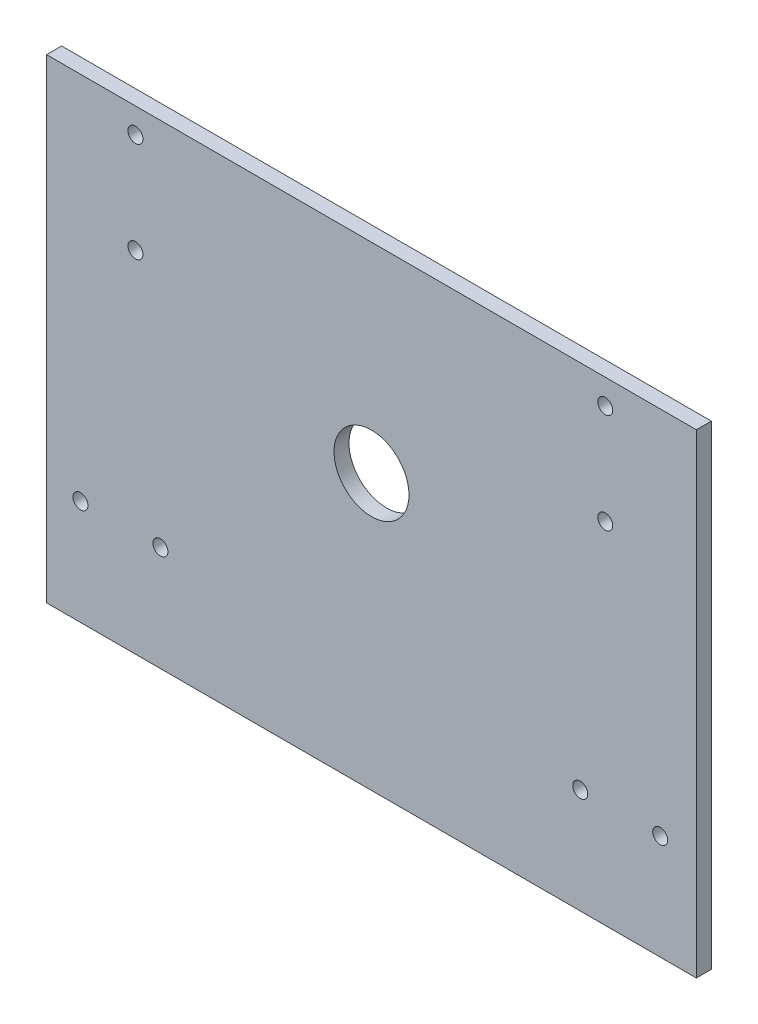
ISO-10303-21;
HEADER;
FILE_DESCRIPTION(('STEP AP214'),'2;1');
FILE_NAME('part.step','',(''),(''),'','','');
FILE_SCHEMA(('AUTOMOTIVE_DESIGN { 1 0 10303 214 1 1 1 1 }'));
ENDSEC;
DATA;
#1=APPLICATION_CONTEXT('core data for automotive mechanical design processes');
#2=APPLICATION_PROTOCOL_DEFINITION('international standard','automotive_design',2000,#1);
#3=PRODUCT_CONTEXT('',#1,'mechanical');
#4=PRODUCT('Part','Part','',(#3));
#5=PRODUCT_RELATED_PRODUCT_CATEGORY('part','',(#4));
#6=PRODUCT_DEFINITION_FORMATION('','',#4);
#7=PRODUCT_DEFINITION_CONTEXT('part definition',#1,'design');
#8=PRODUCT_DEFINITION('design','',#6,#7);
#9=PRODUCT_DEFINITION_SHAPE('','',#8);
#10=(LENGTH_UNIT() NAMED_UNIT(*) SI_UNIT(.MILLI.,.METRE.));
#11=(NAMED_UNIT(*) PLANE_ANGLE_UNIT() SI_UNIT($,.RADIAN.));
#12=(NAMED_UNIT(*) SI_UNIT($,.STERADIAN.) SOLID_ANGLE_UNIT());
#13=UNCERTAINTY_MEASURE_WITH_UNIT(LENGTH_MEASURE(1.E-05),#10,'distance_accuracy_value','');
#14=(GEOMETRIC_REPRESENTATION_CONTEXT(3) GLOBAL_UNCERTAINTY_ASSIGNED_CONTEXT((#13)) GLOBAL_UNIT_ASSIGNED_CONTEXT((#10,
#11,#12)) REPRESENTATION_CONTEXT('',''));
#15=CARTESIAN_POINT('',(0.,0.,0.));
#16=DIRECTION('',(0.,0.,1.));
#17=DIRECTION('',(1.,0.,0.));
#18=AXIS2_PLACEMENT_3D('',#15,#16,#17);
#19=CARTESIAN_POINT('',(-65.,-47.5,3.));
#20=DIRECTION('',(1.,0.,0.));
#21=DIRECTION('',(0.,0.,-1.));
#22=AXIS2_PLACEMENT_3D('',#19,#20,#21);
#23=PLANE('',#22);
#24=DIRECTION('',(0.,-1.,0.));
#25=VECTOR('',#24,1.);
#26=CARTESIAN_POINT('',(-65.,-47.5,0.));
#27=LINE('',#26,#25);
#28=CARTESIAN_POINT('',(-65.,47.5,0.));
#29=VERTEX_POINT('',#28);
#30=CARTESIAN_POINT('',(-65.,-47.5,0.));
#31=VERTEX_POINT('',#30);
#32=EDGE_CURVE('E105',#29,#31,#27,.T.);
#33=ORIENTED_EDGE('',*,*,#32,.T.);
#34=DIRECTION('',(0.,0.,-1.));
#35=VECTOR('',#34,1.);
#36=CARTESIAN_POINT('',(-65.,-47.5,3.));
#37=LINE('',#36,#35);
#38=CARTESIAN_POINT('',(-65.,-47.5,3.));
#39=VERTEX_POINT('',#38);
#40=EDGE_CURVE('E11',#39,#31,#37,.T.);
#41=ORIENTED_EDGE('',*,*,#40,.F.);
#42=DIRECTION('',(0.,-1.,0.));
#43=VECTOR('',#42,1.);
#44=CARTESIAN_POINT('',(-65.,-47.5,3.));
#45=LINE('',#44,#43);
#46=CARTESIAN_POINT('',(-65.,47.5,3.));
#47=VERTEX_POINT('',#46);
#48=EDGE_CURVE('E92',#47,#39,#45,.T.);
#49=ORIENTED_EDGE('',*,*,#48,.F.);
#50=DIRECTION('',(0.,0.,-1.));
#51=VECTOR('',#50,1.);
#52=CARTESIAN_POINT('',(-65.,47.5,3.));
#53=LINE('',#52,#51);
#54=EDGE_CURVE('E101',#47,#29,#53,.T.);
#55=ORIENTED_EDGE('',*,*,#54,.T.);
#56=EDGE_LOOP('',(#33,#41,#49,#55));
#57=FACE_BOUND('',#56,.T.);
#58=ADVANCED_FACE('F40',(#57),#23,.F.);
#59=CARTESIAN_POINT('',(65.,-47.5,3.));
#60=DIRECTION('',(0.,1.,0.));
#61=DIRECTION('',(-1.,0.,0.));
#62=AXIS2_PLACEMENT_3D('',#59,#60,#61);
#63=PLANE('',#62);
#64=DIRECTION('',(1.,0.,0.));
#65=VECTOR('',#64,1.);
#66=CARTESIAN_POINT('',(65.,-47.5,0.));
#67=LINE('',#66,#65);
#68=CARTESIAN_POINT('',(65.,-47.5,0.));
#69=VERTEX_POINT('',#68);
#70=EDGE_CURVE('E96',#31,#69,#67,.T.);
#71=ORIENTED_EDGE('',*,*,#70,.T.);
#72=DIRECTION('',(0.,0.,-1.));
#73=VECTOR('',#72,1.);
#74=CARTESIAN_POINT('',(65.,-47.5,3.));
#75=LINE('',#74,#73);
#76=CARTESIAN_POINT('',(65.,-47.5,3.));
#77=VERTEX_POINT('',#76);
#78=EDGE_CURVE('E49',#77,#69,#75,.T.);
#79=ORIENTED_EDGE('',*,*,#78,.F.);
#80=DIRECTION('',(1.,0.,0.));
#81=VECTOR('',#80,1.);
#82=CARTESIAN_POINT('',(65.,-47.5,3.));
#83=LINE('',#82,#81);
#84=EDGE_CURVE('E87',#39,#77,#83,.T.);
#85=ORIENTED_EDGE('',*,*,#84,.F.);
#86=ORIENTED_EDGE('',*,*,#40,.T.);
#87=EDGE_LOOP('',(#71,#79,#85,#86));
#88=FACE_BOUND('',#87,.T.);
#89=ADVANCED_FACE('F95',(#88),#63,.F.);
#90=CARTESIAN_POINT('',(65.,-47.5,3.));
#91=DIRECTION('',(-1.,0.,0.));
#92=DIRECTION('',(0.,0.,1.));
#93=AXIS2_PLACEMENT_3D('',#90,#91,#92);
#94=PLANE('',#93);
#95=DIRECTION('',(0.,1.,0.));
#96=VECTOR('',#95,1.);
#97=CARTESIAN_POINT('',(65.,-47.5,0.));
#98=LINE('',#97,#96);
#99=CARTESIAN_POINT('',(65.,47.5,0.));
#100=VERTEX_POINT('',#99);
#101=EDGE_CURVE('E74',#69,#100,#98,.T.);
#102=ORIENTED_EDGE('',*,*,#101,.T.);
#103=DIRECTION('',(0.,0.,-1.));
#104=VECTOR('',#103,1.);
#105=CARTESIAN_POINT('',(65.,47.5,3.));
#106=LINE('',#105,#104);
#107=CARTESIAN_POINT('',(65.,47.5,3.));
#108=VERTEX_POINT('',#107);
#109=EDGE_CURVE('E97',#108,#100,#106,.T.);
#110=ORIENTED_EDGE('',*,*,#109,.F.);
#111=DIRECTION('',(0.,1.,0.));
#112=VECTOR('',#111,1.);
#113=CARTESIAN_POINT('',(65.,-47.5,3.));
#114=LINE('',#113,#112);
#115=EDGE_CURVE('E90',#77,#108,#114,.T.);
#116=ORIENTED_EDGE('',*,*,#115,.F.);
#117=ORIENTED_EDGE('',*,*,#78,.T.);
#118=EDGE_LOOP('',(#102,#110,#116,#117));
#119=FACE_BOUND('',#118,.T.);
#120=ADVANCED_FACE('F99',(#119),#94,.F.);
#121=CARTESIAN_POINT('',(65.,47.5,3.));
#122=DIRECTION('',(0.,-1.,0.));
#123=DIRECTION('',(1.,0.,0.));
#124=AXIS2_PLACEMENT_3D('',#121,#122,#123);
#125=PLANE('',#124);
#126=DIRECTION('',(-1.,0.,0.));
#127=VECTOR('',#126,1.);
#128=CARTESIAN_POINT('',(65.,47.5,0.));
#129=LINE('',#128,#127);
#130=EDGE_CURVE('E80',#100,#29,#129,.T.);
#131=ORIENTED_EDGE('',*,*,#130,.T.);
#132=ORIENTED_EDGE('',*,*,#54,.F.);
#133=DIRECTION('',(-1.,0.,0.));
#134=VECTOR('',#133,1.);
#135=CARTESIAN_POINT('',(65.,47.5,3.));
#136=LINE('',#135,#134);
#137=EDGE_CURVE('E57',#108,#47,#136,.T.);
#138=ORIENTED_EDGE('',*,*,#137,.F.);
#139=ORIENTED_EDGE('',*,*,#109,.T.);
#140=EDGE_LOOP('',(#131,#132,#138,#139));
#141=FACE_BOUND('',#140,.T.);
#142=ADVANCED_FACE('F113',(#141),#125,.F.);
#143=CARTESIAN_POINT('',(0.,0.,3.));
#144=DIRECTION('',(0.,0.,1.));
#145=DIRECTION('',(1.,0.,0.));
#146=AXIS2_PLACEMENT_3D('',#143,#144,#145);
#147=PLANE('',#146);
#148=CARTESIAN_POINT('',(1.81105130891979E-12,7.45258790206308,3.));
#149=DIRECTION('',(0.,0.,1.));
#150=DIRECTION('',(1.,0.,0.));
#151=AXIS2_PLACEMENT_3D('',#148,#149,#150);
#152=CIRCLE('',#151,7.5);
#153=CARTESIAN_POINT('',(7.50000000000181,7.45258790206308,3.));
#154=VERTEX_POINT('',#153);
#155=EDGE_CURVE('E166',#154,#154,#152,.T.);
#156=ORIENTED_EDGE('',*,*,#155,.F.);
#157=EDGE_LOOP('',(#156));
#158=FACE_BOUND('',#157,.T.);
#159=CARTESIAN_POINT('',(46.7671126155352,22.5,3.));
#160=DIRECTION('',(0.,0.,1.));
#161=DIRECTION('',(1.,0.,0.));
#162=AXIS2_PLACEMENT_3D('',#159,#160,#161);
#163=CIRCLE('',#162,1.5);
#164=CARTESIAN_POINT('',(48.2671126155352,22.5,3.));
#165=VERTEX_POINT('',#164);
#166=EDGE_CURVE('E135',#165,#165,#163,.T.);
#167=ORIENTED_EDGE('',*,*,#166,.F.);
#168=EDGE_LOOP('',(#167));
#169=FACE_BOUND('',#168,.T.);
#170=CARTESIAN_POINT('',(-47.2328873844649,42.5,3.));
#171=DIRECTION('',(0.,0.,1.));
#172=DIRECTION('',(1.,0.,0.));
#173=AXIS2_PLACEMENT_3D('',#170,#171,#172);
#174=CIRCLE('',#173,1.5);
#175=CARTESIAN_POINT('',(-45.7328873844649,42.5,3.));
#176=VERTEX_POINT('',#175);
#177=EDGE_CURVE('E145',#176,#176,#174,.T.);
#178=ORIENTED_EDGE('',*,*,#177,.F.);
#179=EDGE_LOOP('',(#178));
#180=FACE_BOUND('',#179,.T.);
#181=CARTESIAN_POINT('',(-47.2328873844649,22.5,3.));
#182=DIRECTION('',(0.,0.,1.));
#183=DIRECTION('',(1.,0.,0.));
#184=AXIS2_PLACEMENT_3D('',#181,#182,#183);
#185=CIRCLE('',#184,1.5);
#186=CARTESIAN_POINT('',(-45.7328873844649,22.5,3.));
#187=VERTEX_POINT('',#186);
#188=EDGE_CURVE('E148',#187,#187,#185,.T.);
#189=ORIENTED_EDGE('',*,*,#188,.F.);
#190=EDGE_LOOP('',(#189));
#191=FACE_BOUND('',#190,.T.);
#192=CARTESIAN_POINT('',(46.7671126155352,42.5,3.));
#193=DIRECTION('',(0.,0.,1.));
#194=DIRECTION('',(1.,0.,0.));
#195=AXIS2_PLACEMENT_3D('',#192,#193,#194);
#196=CIRCLE('',#195,1.5);
#197=CARTESIAN_POINT('',(48.2671126155352,42.5,3.));
#198=VERTEX_POINT('',#197);
#199=EDGE_CURVE('E151',#198,#198,#196,.T.);
#200=ORIENTED_EDGE('',*,*,#199,.F.);
#201=EDGE_LOOP('',(#200));
#202=FACE_BOUND('',#201,.T.);
#203=CARTESIAN_POINT('',(57.7671126155351,-26.5,3.));
#204=DIRECTION('',(0.,0.,1.));
#205=DIRECTION('',(1.,0.,0.));
#206=AXIS2_PLACEMENT_3D('',#203,#204,#205);
#207=CIRCLE('',#206,1.5);
#208=CARTESIAN_POINT('',(59.2671126155351,-26.5,3.));
#209=VERTEX_POINT('',#208);
#210=EDGE_CURVE('E108',#209,#209,#207,.T.);
#211=ORIENTED_EDGE('',*,*,#210,.F.);
#212=EDGE_LOOP('',(#211));
#213=FACE_BOUND('',#212,.T.);
#214=CARTESIAN_POINT('',(41.7671126155351,-26.5,3.));
#215=DIRECTION('',(0.,0.,1.));
#216=DIRECTION('',(1.,0.,0.));
#217=AXIS2_PLACEMENT_3D('',#214,#215,#216);
#218=CIRCLE('',#217,1.5);
#219=CARTESIAN_POINT('',(43.2671126155351,-26.5,3.));
#220=VERTEX_POINT('',#219);
#221=EDGE_CURVE('E121',#220,#220,#218,.T.);
#222=ORIENTED_EDGE('',*,*,#221,.F.);
#223=EDGE_LOOP('',(#222));
#224=FACE_BOUND('',#223,.T.);
#225=CARTESIAN_POINT('',(-42.2328873844649,-26.5,3.));
#226=DIRECTION('',(0.,0.,1.));
#227=DIRECTION('',(1.,0.,0.));
#228=AXIS2_PLACEMENT_3D('',#225,#226,#227);
#229=CIRCLE('',#228,1.5);
#230=CARTESIAN_POINT('',(-40.7328873844649,-26.5,3.));
#231=VERTEX_POINT('',#230);
#232=EDGE_CURVE('E124',#231,#231,#229,.T.);
#233=ORIENTED_EDGE('',*,*,#232,.F.);
#234=EDGE_LOOP('',(#233));
#235=FACE_BOUND('',#234,.T.);
#236=CARTESIAN_POINT('',(-58.2328873844649,-26.5,3.));
#237=DIRECTION('',(0.,0.,1.));
#238=DIRECTION('',(1.,0.,0.));
#239=AXIS2_PLACEMENT_3D('',#236,#237,#238);
#240=CIRCLE('',#239,1.5);
#241=CARTESIAN_POINT('',(-56.7328873844649,-26.5,3.));
#242=VERTEX_POINT('',#241);
#243=EDGE_CURVE('E127',#242,#242,#240,.T.);
#244=ORIENTED_EDGE('',*,*,#243,.F.);
#245=EDGE_LOOP('',(#244));
#246=FACE_BOUND('',#245,.T.);
#247=ORIENTED_EDGE('',*,*,#48,.T.);
#248=ORIENTED_EDGE('',*,*,#84,.T.);
#249=ORIENTED_EDGE('',*,*,#115,.T.);
#250=ORIENTED_EDGE('',*,*,#137,.T.);
#251=EDGE_LOOP('',(#247,#248,#249,#250));
#252=FACE_BOUND('',#251,.T.);
#253=ADVANCED_FACE('F88',(#158,#169,#180,#191,#202,#213,#224,#235,#246,#252),#147,.T.);
#254=CARTESIAN_POINT('',(0.,0.,0.));
#255=DIRECTION('',(0.,0.,1.));
#256=DIRECTION('',(1.,0.,0.));
#257=AXIS2_PLACEMENT_3D('',#254,#255,#256);
#258=PLANE('',#257);
#259=CARTESIAN_POINT('',(1.81105130891979E-12,7.45258790206308,0.));
#260=DIRECTION('',(0.,0.,1.));
#261=DIRECTION('',(1.,0.,0.));
#262=AXIS2_PLACEMENT_3D('',#259,#260,#261);
#263=CIRCLE('',#262,7.5);
#264=CARTESIAN_POINT('',(7.50000000000181,7.45258790206308,0.));
#265=VERTEX_POINT('',#264);
#266=EDGE_CURVE('E43',#265,#265,#263,.T.);
#267=ORIENTED_EDGE('',*,*,#266,.T.);
#268=EDGE_LOOP('',(#267));
#269=FACE_BOUND('',#268,.T.);
#270=CARTESIAN_POINT('',(46.7671126155352,22.5,0.));
#271=DIRECTION('',(0.,0.,-1.));
#272=DIRECTION('',(-1.,0.,0.));
#273=AXIS2_PLACEMENT_3D('',#270,#271,#272);
#274=CIRCLE('',#273,1.5);
#275=CARTESIAN_POINT('',(45.2671126155352,22.5,0.));
#276=VERTEX_POINT('',#275);
#277=EDGE_CURVE('E157',#276,#276,#274,.T.);
#278=ORIENTED_EDGE('',*,*,#277,.F.);
#279=EDGE_LOOP('',(#278));
#280=FACE_BOUND('',#279,.T.);
#281=CARTESIAN_POINT('',(-47.2328873844649,42.5,0.));
#282=DIRECTION('',(0.,0.,-1.));
#283=DIRECTION('',(-1.,0.,0.));
#284=AXIS2_PLACEMENT_3D('',#281,#282,#283);
#285=CIRCLE('',#284,1.5);
#286=CARTESIAN_POINT('',(-48.7328873844649,42.5,0.));
#287=VERTEX_POINT('',#286);
#288=EDGE_CURVE('E158',#287,#287,#285,.T.);
#289=ORIENTED_EDGE('',*,*,#288,.F.);
#290=EDGE_LOOP('',(#289));
#291=FACE_BOUND('',#290,.T.);
#292=CARTESIAN_POINT('',(-47.2328873844649,22.5,0.));
#293=DIRECTION('',(0.,0.,-1.));
#294=DIRECTION('',(-1.,0.,0.));
#295=AXIS2_PLACEMENT_3D('',#292,#293,#294);
#296=CIRCLE('',#295,1.5);
#297=CARTESIAN_POINT('',(-48.7328873844649,22.5,0.));
#298=VERTEX_POINT('',#297);
#299=EDGE_CURVE('E161',#298,#298,#296,.T.);
#300=ORIENTED_EDGE('',*,*,#299,.F.);
#301=EDGE_LOOP('',(#300));
#302=FACE_BOUND('',#301,.T.);
#303=CARTESIAN_POINT('',(46.7671126155352,42.5,0.));
#304=DIRECTION('',(0.,0.,-1.));
#305=DIRECTION('',(-1.,0.,0.));
#306=AXIS2_PLACEMENT_3D('',#303,#304,#305);
#307=CIRCLE('',#306,1.5);
#308=CARTESIAN_POINT('',(45.2671126155352,42.5,0.));
#309=VERTEX_POINT('',#308);
#310=EDGE_CURVE('E154',#309,#309,#307,.T.);
#311=ORIENTED_EDGE('',*,*,#310,.F.);
#312=EDGE_LOOP('',(#311));
#313=FACE_BOUND('',#312,.T.);
#314=CARTESIAN_POINT('',(57.7671126155351,-26.5,0.));
#315=DIRECTION('',(0.,0.,-1.));
#316=DIRECTION('',(-1.,0.,0.));
#317=AXIS2_PLACEMENT_3D('',#314,#315,#316);
#318=CIRCLE('',#317,1.5);
#319=CARTESIAN_POINT('',(56.2671126155351,-26.5,0.));
#320=VERTEX_POINT('',#319);
#321=EDGE_CURVE('E130',#320,#320,#318,.T.);
#322=ORIENTED_EDGE('',*,*,#321,.F.);
#323=EDGE_LOOP('',(#322));
#324=FACE_BOUND('',#323,.T.);
#325=CARTESIAN_POINT('',(41.7671126155351,-26.5,0.));
#326=DIRECTION('',(0.,0.,-1.));
#327=DIRECTION('',(-1.,0.,0.));
#328=AXIS2_PLACEMENT_3D('',#325,#326,#327);
#329=CIRCLE('',#328,1.5);
#330=CARTESIAN_POINT('',(40.2671126155351,-26.5,0.));
#331=VERTEX_POINT('',#330);
#332=EDGE_CURVE('E138',#331,#331,#329,.T.);
#333=ORIENTED_EDGE('',*,*,#332,.F.);
#334=EDGE_LOOP('',(#333));
#335=FACE_BOUND('',#334,.T.);
#336=CARTESIAN_POINT('',(-42.2328873844649,-26.5,0.));
#337=DIRECTION('',(0.,0.,-1.));
#338=DIRECTION('',(-1.,0.,0.));
#339=AXIS2_PLACEMENT_3D('',#336,#337,#338);
#340=CIRCLE('',#339,1.5);
#341=CARTESIAN_POINT('',(-43.7328873844649,-26.5,0.));
#342=VERTEX_POINT('',#341);
#343=EDGE_CURVE('E134',#342,#342,#340,.T.);
#344=ORIENTED_EDGE('',*,*,#343,.F.);
#345=EDGE_LOOP('',(#344));
#346=FACE_BOUND('',#345,.T.);
#347=CARTESIAN_POINT('',(-58.2328873844649,-26.5,0.));
#348=DIRECTION('',(0.,0.,-1.));
#349=DIRECTION('',(-1.,0.,0.));
#350=AXIS2_PLACEMENT_3D('',#347,#348,#349);
#351=CIRCLE('',#350,1.5);
#352=CARTESIAN_POINT('',(-59.7328873844649,-26.5,0.));
#353=VERTEX_POINT('',#352);
#354=EDGE_CURVE('E131',#353,#353,#351,.T.);
#355=ORIENTED_EDGE('',*,*,#354,.F.);
#356=EDGE_LOOP('',(#355));
#357=FACE_BOUND('',#356,.T.);
#358=ORIENTED_EDGE('',*,*,#32,.F.);
#359=ORIENTED_EDGE('',*,*,#130,.F.);
#360=ORIENTED_EDGE('',*,*,#101,.F.);
#361=ORIENTED_EDGE('',*,*,#70,.F.);
#362=EDGE_LOOP('',(#358,#359,#360,#361));
#363=FACE_BOUND('',#362,.T.);
#364=ADVANCED_FACE('F116',(#269,#280,#291,#302,#313,#324,#335,#346,#357,#363),#258,.F.);
#365=CARTESIAN_POINT('',(-58.2328873844649,-26.5,10.));
#366=DIRECTION('',(0.,0.,-1.));
#367=DIRECTION('',(-1.,0.,0.));
#368=AXIS2_PLACEMENT_3D('',#365,#366,#367);
#369=CYLINDRICAL_SURFACE('',#368,1.5);
#370=ORIENTED_EDGE('',*,*,#243,.T.);
#371=EDGE_LOOP('',(#370));
#372=FACE_BOUND('',#371,.T.);
#373=ORIENTED_EDGE('',*,*,#354,.T.);
#374=EDGE_LOOP('',(#373));
#375=FACE_BOUND('',#374,.T.);
#376=ADVANCED_FACE('F199',(#372,#375),#369,.F.);
#377=CARTESIAN_POINT('',(-42.2328873844649,-26.5,10.));
#378=DIRECTION('',(0.,0.,-1.));
#379=DIRECTION('',(-1.,0.,0.));
#380=AXIS2_PLACEMENT_3D('',#377,#378,#379);
#381=CYLINDRICAL_SURFACE('',#380,1.5);
#382=ORIENTED_EDGE('',*,*,#232,.T.);
#383=EDGE_LOOP('',(#382));
#384=FACE_BOUND('',#383,.T.);
#385=ORIENTED_EDGE('',*,*,#343,.T.);
#386=EDGE_LOOP('',(#385));
#387=FACE_BOUND('',#386,.T.);
#388=ADVANCED_FACE('F205',(#384,#387),#381,.F.);
#389=CARTESIAN_POINT('',(41.7671126155351,-26.5,10.));
#390=DIRECTION('',(0.,0.,-1.));
#391=DIRECTION('',(-1.,0.,0.));
#392=AXIS2_PLACEMENT_3D('',#389,#390,#391);
#393=CYLINDRICAL_SURFACE('',#392,1.5);
#394=ORIENTED_EDGE('',*,*,#221,.T.);
#395=EDGE_LOOP('',(#394));
#396=FACE_BOUND('',#395,.T.);
#397=ORIENTED_EDGE('',*,*,#332,.T.);
#398=EDGE_LOOP('',(#397));
#399=FACE_BOUND('',#398,.T.);
#400=ADVANCED_FACE('F209',(#396,#399),#393,.F.);
#401=CARTESIAN_POINT('',(57.7671126155351,-26.5,10.));
#402=DIRECTION('',(0.,0.,-1.));
#403=DIRECTION('',(-1.,0.,0.));
#404=AXIS2_PLACEMENT_3D('',#401,#402,#403);
#405=CYLINDRICAL_SURFACE('',#404,1.5);
#406=ORIENTED_EDGE('',*,*,#210,.T.);
#407=EDGE_LOOP('',(#406));
#408=FACE_BOUND('',#407,.T.);
#409=ORIENTED_EDGE('',*,*,#321,.T.);
#410=EDGE_LOOP('',(#409));
#411=FACE_BOUND('',#410,.T.);
#412=ADVANCED_FACE('F213',(#408,#411),#405,.F.);
#413=CARTESIAN_POINT('',(46.7671126155352,42.5,10.));
#414=DIRECTION('',(0.,0.,-1.));
#415=DIRECTION('',(-1.,0.,0.));
#416=AXIS2_PLACEMENT_3D('',#413,#414,#415);
#417=CYLINDRICAL_SURFACE('',#416,1.5);
#418=ORIENTED_EDGE('',*,*,#199,.T.);
#419=EDGE_LOOP('',(#418));
#420=FACE_BOUND('',#419,.T.);
#421=ORIENTED_EDGE('',*,*,#310,.T.);
#422=EDGE_LOOP('',(#421));
#423=FACE_BOUND('',#422,.T.);
#424=ADVANCED_FACE('F217',(#420,#423),#417,.F.);
#425=CARTESIAN_POINT('',(-47.2328873844649,22.5,10.));
#426=DIRECTION('',(0.,0.,-1.));
#427=DIRECTION('',(-1.,0.,0.));
#428=AXIS2_PLACEMENT_3D('',#425,#426,#427);
#429=CYLINDRICAL_SURFACE('',#428,1.5);
#430=ORIENTED_EDGE('',*,*,#188,.T.);
#431=EDGE_LOOP('',(#430));
#432=FACE_BOUND('',#431,.T.);
#433=ORIENTED_EDGE('',*,*,#299,.T.);
#434=EDGE_LOOP('',(#433));
#435=FACE_BOUND('',#434,.T.);
#436=ADVANCED_FACE('F221',(#432,#435),#429,.F.);
#437=CARTESIAN_POINT('',(-47.2328873844649,42.5,10.));
#438=DIRECTION('',(0.,0.,-1.));
#439=DIRECTION('',(-1.,0.,0.));
#440=AXIS2_PLACEMENT_3D('',#437,#438,#439);
#441=CYLINDRICAL_SURFACE('',#440,1.5);
#442=ORIENTED_EDGE('',*,*,#177,.T.);
#443=EDGE_LOOP('',(#442));
#444=FACE_BOUND('',#443,.T.);
#445=ORIENTED_EDGE('',*,*,#288,.T.);
#446=EDGE_LOOP('',(#445));
#447=FACE_BOUND('',#446,.T.);
#448=ADVANCED_FACE('F182',(#444,#447),#441,.F.);
#449=CARTESIAN_POINT('',(46.7671126155352,22.5,10.));
#450=DIRECTION('',(0.,0.,-1.));
#451=DIRECTION('',(-1.,0.,0.));
#452=AXIS2_PLACEMENT_3D('',#449,#450,#451);
#453=CYLINDRICAL_SURFACE('',#452,1.5);
#454=ORIENTED_EDGE('',*,*,#166,.T.);
#455=EDGE_LOOP('',(#454));
#456=FACE_BOUND('',#455,.T.);
#457=ORIENTED_EDGE('',*,*,#277,.T.);
#458=EDGE_LOOP('',(#457));
#459=FACE_BOUND('',#458,.T.);
#460=ADVANCED_FACE('F177',(#456,#459),#453,.F.);
#461=CARTESIAN_POINT('',(1.81105130891979E-12,7.45258790206308,-7.));
#462=DIRECTION('',(0.,0.,1.));
#463=DIRECTION('',(1.,0.,0.));
#464=AXIS2_PLACEMENT_3D('',#461,#462,#463);
#465=CYLINDRICAL_SURFACE('',#464,7.5);
#466=ORIENTED_EDGE('',*,*,#155,.T.);
#467=EDGE_LOOP('',(#466));
#468=FACE_BOUND('',#467,.T.);
#469=ORIENTED_EDGE('',*,*,#266,.F.);
#470=EDGE_LOOP('',(#469));
#471=FACE_BOUND('',#470,.T.);
#472=ADVANCED_FACE('F175',(#468,#471),#465,.F.);
#473=CLOSED_SHELL('',(#58,#89,#120,#142,#253,#364,#376,#388,#400,#412,#424,#436,#448,#460,#472));
#474=MANIFOLD_SOLID_BREP('B2',#473);
#475=ADVANCED_BREP_SHAPE_REPRESENTATION('',(#18,#474),#14);
#476=SHAPE_DEFINITION_REPRESENTATION(#9,#475);
ENDSEC;
END-ISO-10303-21;
